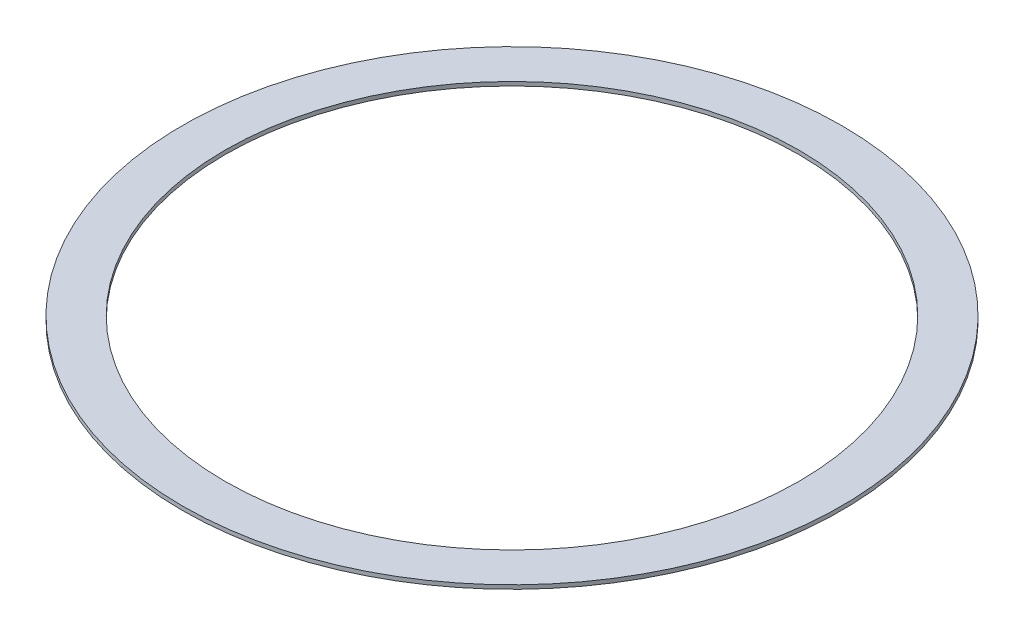
ISO-10303-21;
HEADER;
FILE_DESCRIPTION(('STEP AP214'),'2;1');
FILE_NAME('part.step','',(''),(''),'','','');
FILE_SCHEMA(('AUTOMOTIVE_DESIGN { 1 0 10303 214 1 1 1 1 }'));
ENDSEC;
DATA;
#1=APPLICATION_CONTEXT('core data for automotive mechanical design processes');
#2=APPLICATION_PROTOCOL_DEFINITION('international standard','automotive_design',2000,#1);
#3=PRODUCT_CONTEXT('',#1,'mechanical');
#4=PRODUCT('Part','Part','',(#3));
#5=PRODUCT_RELATED_PRODUCT_CATEGORY('part','',(#4));
#6=PRODUCT_DEFINITION_FORMATION('','',#4);
#7=PRODUCT_DEFINITION_CONTEXT('part definition',#1,'design');
#8=PRODUCT_DEFINITION('design','',#6,#7);
#9=PRODUCT_DEFINITION_SHAPE('','',#8);
#10=(LENGTH_UNIT() NAMED_UNIT(*) SI_UNIT(.MILLI.,.METRE.));
#11=(NAMED_UNIT(*) PLANE_ANGLE_UNIT() SI_UNIT($,.RADIAN.));
#12=(NAMED_UNIT(*) SI_UNIT($,.STERADIAN.) SOLID_ANGLE_UNIT());
#13=UNCERTAINTY_MEASURE_WITH_UNIT(LENGTH_MEASURE(1.E-05),#10,'distance_accuracy_value','');
#14=(GEOMETRIC_REPRESENTATION_CONTEXT(3) GLOBAL_UNCERTAINTY_ASSIGNED_CONTEXT((#13)) GLOBAL_UNIT_ASSIGNED_CONTEXT((#10,
#11,#12)) REPRESENTATION_CONTEXT('',''));
#15=CARTESIAN_POINT('',(0.,0.,0.));
#16=DIRECTION('',(0.,0.,1.));
#17=DIRECTION('',(1.,0.,0.));
#18=AXIS2_PLACEMENT_3D('',#15,#16,#17);
#19=CARTESIAN_POINT('',(0.,0.762,0.));
#20=DIRECTION('',(0.,-1.,0.));
#21=DIRECTION('',(0.,0.,-1.));
#22=AXIS2_PLACEMENT_3D('',#19,#20,#21);
#23=CYLINDRICAL_SURFACE('',#22,55.5625);
#24=CARTESIAN_POINT('',(0.,0.762,0.));
#25=DIRECTION('',(0.,1.,0.));
#26=DIRECTION('',(0.,0.,1.));
#27=AXIS2_PLACEMENT_3D('',#24,#25,#26);
#28=CIRCLE('',#27,55.5625);
#29=CARTESIAN_POINT('',(0.,0.762,-55.5625));
#30=VERTEX_POINT('',#29);
#31=EDGE_CURVE('E47',#30,#30,#28,.T.);
#32=CARTESIAN_POINT('',(0.,0.,0.));
#33=DIRECTION('',(0.,1.,0.));
#34=DIRECTION('',(0.,0.,1.));
#35=AXIS2_PLACEMENT_3D('',#32,#33,#34);
#36=CIRCLE('',#35,55.5625);
#37=CARTESIAN_POINT('',(0.,0.,-55.5625));
#38=VERTEX_POINT('',#37);
#39=EDGE_CURVE('E53',#38,#38,#36,.T.);
#40=CARTESIAN_POINT('',(0.,0.762,-55.5625));
#41=CARTESIAN_POINT('',(0.,0.7540625,-55.5625));
#42=CARTESIAN_POINT('',(0.,0.746125,-55.5625));
#43=CARTESIAN_POINT('',(0.,0.73025,-55.5625));
#44=CARTESIAN_POINT('',(0.,0.7223125,-55.5625));
#45=CARTESIAN_POINT('',(0.,0.7064375,-55.5625));
#46=CARTESIAN_POINT('',(0.,0.6985,-55.5625));
#47=CARTESIAN_POINT('',(0.,0.682625,-55.5625));
#48=CARTESIAN_POINT('',(0.,0.6746875,-55.5625));
#49=CARTESIAN_POINT('',(0.,0.6588125,-55.5625));
#50=CARTESIAN_POINT('',(0.,0.650875,-55.5625));
#51=CARTESIAN_POINT('',(0.,0.635,-55.5625));
#52=CARTESIAN_POINT('',(0.,0.6270625,-55.5625));
#53=CARTESIAN_POINT('',(0.,0.6111875,-55.5625));
#54=CARTESIAN_POINT('',(0.,0.60325,-55.5625));
#55=CARTESIAN_POINT('',(0.,0.587375,-55.5625));
#56=CARTESIAN_POINT('',(0.,0.5794375,-55.5625));
#57=CARTESIAN_POINT('',(0.,0.5635625,-55.5625));
#58=CARTESIAN_POINT('',(0.,0.555625,-55.5625));
#59=CARTESIAN_POINT('',(0.,0.53975,-55.5625));
#60=CARTESIAN_POINT('',(0.,0.5318125,-55.5625));
#61=CARTESIAN_POINT('',(0.,0.5159375,-55.5625));
#62=CARTESIAN_POINT('',(0.,0.508,-55.5625));
#63=CARTESIAN_POINT('',(0.,0.492125,-55.5625));
#64=CARTESIAN_POINT('',(0.,0.4841875,-55.5625));
#65=CARTESIAN_POINT('',(0.,0.4683125,-55.5625));
#66=CARTESIAN_POINT('',(0.,0.460375,-55.5625));
#67=CARTESIAN_POINT('',(0.,0.4445,-55.5625));
#68=CARTESIAN_POINT('',(0.,0.4365625,-55.5625));
#69=CARTESIAN_POINT('',(0.,0.4206875,-55.5625));
#70=CARTESIAN_POINT('',(0.,0.41275,-55.5625));
#71=CARTESIAN_POINT('',(0.,0.396875,-55.5625));
#72=CARTESIAN_POINT('',(0.,0.3889375,-55.5625));
#73=CARTESIAN_POINT('',(0.,0.3730625,-55.5625));
#74=CARTESIAN_POINT('',(0.,0.365125,-55.5625));
#75=CARTESIAN_POINT('',(0.,0.34925,-55.5625));
#76=CARTESIAN_POINT('',(0.,0.3413125,-55.5625));
#77=CARTESIAN_POINT('',(0.,0.3254375,-55.5625));
#78=CARTESIAN_POINT('',(0.,0.3175,-55.5625));
#79=CARTESIAN_POINT('',(0.,0.301625,-55.5625));
#80=CARTESIAN_POINT('',(0.,0.2936875,-55.5625));
#81=CARTESIAN_POINT('',(0.,0.2778125,-55.5625));
#82=CARTESIAN_POINT('',(0.,0.269875,-55.5625));
#83=CARTESIAN_POINT('',(0.,0.254,-55.5625));
#84=CARTESIAN_POINT('',(0.,0.2460625,-55.5625));
#85=CARTESIAN_POINT('',(0.,0.2301875,-55.5625));
#86=CARTESIAN_POINT('',(0.,0.22225,-55.5625));
#87=CARTESIAN_POINT('',(0.,0.206375,-55.5625));
#88=CARTESIAN_POINT('',(0.,0.1984375,-55.5625));
#89=CARTESIAN_POINT('',(0.,0.1825625,-55.5625));
#90=CARTESIAN_POINT('',(0.,0.174625,-55.5625));
#91=CARTESIAN_POINT('',(0.,0.15875,-55.5625));
#92=CARTESIAN_POINT('',(0.,0.1508125,-55.5625));
#93=CARTESIAN_POINT('',(0.,0.1349375,-55.5625));
#94=CARTESIAN_POINT('',(0.,0.127,-55.5625));
#95=CARTESIAN_POINT('',(0.,0.111125,-55.5625));
#96=CARTESIAN_POINT('',(0.,0.1031875,-55.5625));
#97=CARTESIAN_POINT('',(0.,0.0873125,-55.5625));
#98=CARTESIAN_POINT('',(0.,0.079375,-55.5625));
#99=CARTESIAN_POINT('',(0.,0.0635,-55.5625));
#100=CARTESIAN_POINT('',(0.,0.0555625,-55.5625));
#101=CARTESIAN_POINT('',(0.,0.0396875,-55.5625));
#102=CARTESIAN_POINT('',(0.,0.03175,-55.5625));
#103=CARTESIAN_POINT('',(0.,0.015875,-55.5625));
#104=CARTESIAN_POINT('',(0.,0.00793749999999999,-55.5625));
#105=CARTESIAN_POINT('',(0.,0.,-55.5625));
#106=B_SPLINE_CURVE_WITH_KNOTS('',3,(#40,#41,#42,#43,#44,#45,#46,#47,#48,#49,#50,#51,#52,#53,
#54,#55,#56,#57,#58,#59,#60,#61,#62,#63,#64,#65,#66,#67,#68,#69,#70,#71,#72,#73,#74,#75,#76,#77,
#78,#79,#80,#81,#82,#83,#84,#85,#86,#87,#88,#89,#90,#91,#92,#93,#94,#95,#96,#97,#98,#99,#100,
#101,#102,#103,#104,#105),.UNSPECIFIED.,.F.,.F.,(4,2,2,2,2,2,2,2,2,2,2,2,2,2,2,2,2,2,2,2,2,2,2,
2,2,2,2,2,2,2,2,2,4),(0.,0.0238125,0.0476249999999999,0.0714374999999999,0.09525,0.1190625,
0.142875,0.1666875,0.1905,0.2143125,0.238125,0.2619375,0.28575,0.3095625,0.333375,0.3571875,
0.381,0.4048125,0.428625,0.4524375,0.47625,0.5000625,0.523875,0.5476875,0.5715,0.5953125,
0.619125,0.6429375,0.66675,0.6905625,0.714375,0.7381875,0.762),.UNSPECIFIED.);
#107=EDGE_CURVE('BSEAM40',#30,#38,#106,.T.);
#108=ORIENTED_EDGE('',*,*,#31,.T.);
#109=ORIENTED_EDGE('',*,*,#39,.F.);
#110=ORIENTED_EDGE('',*,*,#107,.T.);
#111=ORIENTED_EDGE('',*,*,#107,.F.);
#112=EDGE_LOOP('',(#108,#110,#109,#111));
#113=FACE_BOUND('',#112,.T.);
#114=ADVANCED_FACE('F40',(#113),#23,.F.);
#115=CARTESIAN_POINT('',(0.,0.762,0.));
#116=DIRECTION('',(0.,-1.,0.));
#117=DIRECTION('',(0.,0.,-1.));
#118=AXIS2_PLACEMENT_3D('',#115,#116,#117);
#119=CYLINDRICAL_SURFACE('',#118,63.8175);
#120=CARTESIAN_POINT('',(0.,0.762,0.));
#121=DIRECTION('',(0.,1.,0.));
#122=DIRECTION('',(0.,0.,1.));
#123=AXIS2_PLACEMENT_3D('',#120,#121,#122);
#124=CIRCLE('',#123,63.8175);
#125=CARTESIAN_POINT('',(0.,0.762,-63.8175));
#126=VERTEX_POINT('',#125);
#127=EDGE_CURVE('E10',#126,#126,#124,.T.);
#128=CARTESIAN_POINT('',(0.,0.,0.));
#129=DIRECTION('',(0.,1.,0.));
#130=DIRECTION('',(0.,0.,1.));
#131=AXIS2_PLACEMENT_3D('',#128,#129,#130);
#132=CIRCLE('',#131,63.8175);
#133=CARTESIAN_POINT('',(0.,0.,-63.8175));
#134=VERTEX_POINT('',#133);
#135=EDGE_CURVE('E43',#134,#134,#132,.T.);
#136=CARTESIAN_POINT('',(0.,0.762,-63.8175));
#137=CARTESIAN_POINT('',(0.,0.7540625,-63.8175));
#138=CARTESIAN_POINT('',(0.,0.746125,-63.8175));
#139=CARTESIAN_POINT('',(0.,0.73025,-63.8175));
#140=CARTESIAN_POINT('',(0.,0.7223125,-63.8175));
#141=CARTESIAN_POINT('',(0.,0.7064375,-63.8175));
#142=CARTESIAN_POINT('',(0.,0.6985,-63.8175));
#143=CARTESIAN_POINT('',(0.,0.682625,-63.8175));
#144=CARTESIAN_POINT('',(0.,0.6746875,-63.8175));
#145=CARTESIAN_POINT('',(0.,0.6588125,-63.8175));
#146=CARTESIAN_POINT('',(0.,0.650875,-63.8175));
#147=CARTESIAN_POINT('',(0.,0.635,-63.8175));
#148=CARTESIAN_POINT('',(0.,0.6270625,-63.8175));
#149=CARTESIAN_POINT('',(0.,0.6111875,-63.8175));
#150=CARTESIAN_POINT('',(0.,0.60325,-63.8175));
#151=CARTESIAN_POINT('',(0.,0.587375,-63.8175));
#152=CARTESIAN_POINT('',(0.,0.5794375,-63.8175));
#153=CARTESIAN_POINT('',(0.,0.5635625,-63.8175));
#154=CARTESIAN_POINT('',(0.,0.555625,-63.8175));
#155=CARTESIAN_POINT('',(0.,0.53975,-63.8175));
#156=CARTESIAN_POINT('',(0.,0.5318125,-63.8175));
#157=CARTESIAN_POINT('',(0.,0.5159375,-63.8175));
#158=CARTESIAN_POINT('',(0.,0.508,-63.8175));
#159=CARTESIAN_POINT('',(0.,0.492125,-63.8175));
#160=CARTESIAN_POINT('',(0.,0.4841875,-63.8175));
#161=CARTESIAN_POINT('',(0.,0.4683125,-63.8175));
#162=CARTESIAN_POINT('',(0.,0.460375,-63.8175));
#163=CARTESIAN_POINT('',(0.,0.4445,-63.8175));
#164=CARTESIAN_POINT('',(0.,0.4365625,-63.8175));
#165=CARTESIAN_POINT('',(0.,0.4206875,-63.8175));
#166=CARTESIAN_POINT('',(0.,0.41275,-63.8175));
#167=CARTESIAN_POINT('',(0.,0.396875,-63.8175));
#168=CARTESIAN_POINT('',(0.,0.3889375,-63.8175));
#169=CARTESIAN_POINT('',(0.,0.3730625,-63.8175));
#170=CARTESIAN_POINT('',(0.,0.365125,-63.8175));
#171=CARTESIAN_POINT('',(0.,0.34925,-63.8175));
#172=CARTESIAN_POINT('',(0.,0.3413125,-63.8175));
#173=CARTESIAN_POINT('',(0.,0.3254375,-63.8175));
#174=CARTESIAN_POINT('',(0.,0.3175,-63.8175));
#175=CARTESIAN_POINT('',(0.,0.301625,-63.8175));
#176=CARTESIAN_POINT('',(0.,0.2936875,-63.8175));
#177=CARTESIAN_POINT('',(0.,0.2778125,-63.8175));
#178=CARTESIAN_POINT('',(0.,0.269875,-63.8175));
#179=CARTESIAN_POINT('',(0.,0.254,-63.8175));
#180=CARTESIAN_POINT('',(0.,0.2460625,-63.8175));
#181=CARTESIAN_POINT('',(0.,0.2301875,-63.8175));
#182=CARTESIAN_POINT('',(0.,0.22225,-63.8175));
#183=CARTESIAN_POINT('',(0.,0.206375,-63.8175));
#184=CARTESIAN_POINT('',(0.,0.1984375,-63.8175));
#185=CARTESIAN_POINT('',(0.,0.1825625,-63.8175));
#186=CARTESIAN_POINT('',(0.,0.174625,-63.8175));
#187=CARTESIAN_POINT('',(0.,0.15875,-63.8175));
#188=CARTESIAN_POINT('',(0.,0.1508125,-63.8175));
#189=CARTESIAN_POINT('',(0.,0.1349375,-63.8175));
#190=CARTESIAN_POINT('',(0.,0.127,-63.8175));
#191=CARTESIAN_POINT('',(0.,0.111125,-63.8175));
#192=CARTESIAN_POINT('',(0.,0.1031875,-63.8175));
#193=CARTESIAN_POINT('',(0.,0.0873125,-63.8175));
#194=CARTESIAN_POINT('',(0.,0.079375,-63.8175));
#195=CARTESIAN_POINT('',(0.,0.0635,-63.8175));
#196=CARTESIAN_POINT('',(0.,0.0555625,-63.8175));
#197=CARTESIAN_POINT('',(0.,0.0396875,-63.8175));
#198=CARTESIAN_POINT('',(0.,0.03175,-63.8175));
#199=CARTESIAN_POINT('',(0.,0.015875,-63.8175));
#200=CARTESIAN_POINT('',(0.,0.00793749999999999,-63.8175));
#201=CARTESIAN_POINT('',(0.,0.,-63.8175));
#202=B_SPLINE_CURVE_WITH_KNOTS('',3,(#136,#137,#138,#139,#140,#141,#142,#143,#144,#145,#146,
#147,#148,#149,#150,#151,#152,#153,#154,#155,#156,#157,#158,#159,#160,#161,#162,#163,#164,#165,
#166,#167,#168,#169,#170,#171,#172,#173,#174,#175,#176,#177,#178,#179,#180,#181,#182,#183,#184,
#185,#186,#187,#188,#189,#190,#191,#192,#193,#194,#195,#196,#197,#198,#199,#200,#201),
.UNSPECIFIED.,.F.,.F.,(4,2,2,2,2,2,2,2,2,2,2,2,2,2,2,2,2,2,2,2,2,2,2,2,2,2,2,2,2,2,2,2,4),(0.,
0.0238125000000001,0.047625,0.0714375,0.0952500000000001,0.1190625,0.142875,0.1666875,0.1905,
0.2143125,0.238125,0.2619375,0.28575,0.3095625,0.333375,0.3571875,0.381,0.4048125,0.428625,
0.4524375,0.47625,0.5000625,0.523875,0.5476875,0.5715,0.5953125,0.619125,0.6429375,0.66675,
0.6905625,0.714375,0.7381875,0.762),.UNSPECIFIED.);
#203=EDGE_CURVE('BSEAM60',#126,#134,#202,.T.);
#204=ORIENTED_EDGE('',*,*,#127,.F.);
#205=ORIENTED_EDGE('',*,*,#135,.T.);
#206=ORIENTED_EDGE('',*,*,#203,.T.);
#207=ORIENTED_EDGE('',*,*,#203,.F.);
#208=EDGE_LOOP('',(#204,#206,#205,#207));
#209=FACE_BOUND('',#208,.T.);
#210=ADVANCED_FACE('F60',(#209),#119,.T.);
#211=CARTESIAN_POINT('',(0.,0.762,0.));
#212=DIRECTION('',(0.,1.,0.));
#213=DIRECTION('',(0.,0.,1.));
#214=AXIS2_PLACEMENT_3D('',#211,#212,#213);
#215=PLANE('',#214);
#216=ORIENTED_EDGE('',*,*,#31,.F.);
#217=EDGE_LOOP('',(#216));
#218=FACE_BOUND('',#217,.T.);
#219=ORIENTED_EDGE('',*,*,#127,.T.);
#220=EDGE_LOOP('',(#219));
#221=FACE_BOUND('',#220,.T.);
#222=ADVANCED_FACE('F64',(#218,#221),#215,.T.);
#223=CARTESIAN_POINT('',(0.,0.,0.));
#224=DIRECTION('',(0.,1.,0.));
#225=DIRECTION('',(0.,0.,1.));
#226=AXIS2_PLACEMENT_3D('',#223,#224,#225);
#227=PLANE('',#226);
#228=ORIENTED_EDGE('',*,*,#39,.T.);
#229=EDGE_LOOP('',(#228));
#230=FACE_BOUND('',#229,.T.);
#231=ORIENTED_EDGE('',*,*,#135,.F.);
#232=EDGE_LOOP('',(#231));
#233=FACE_BOUND('',#232,.T.);
#234=ADVANCED_FACE('F62',(#230,#233),#227,.F.);
#235=CLOSED_SHELL('',(#114,#210,#222,#234));
#236=MANIFOLD_SOLID_BREP('B2',#235);
#237=ADVANCED_BREP_SHAPE_REPRESENTATION('',(#18,#236),#14);
#238=SHAPE_DEFINITION_REPRESENTATION(#9,#237);
ENDSEC;
END-ISO-10303-21;
